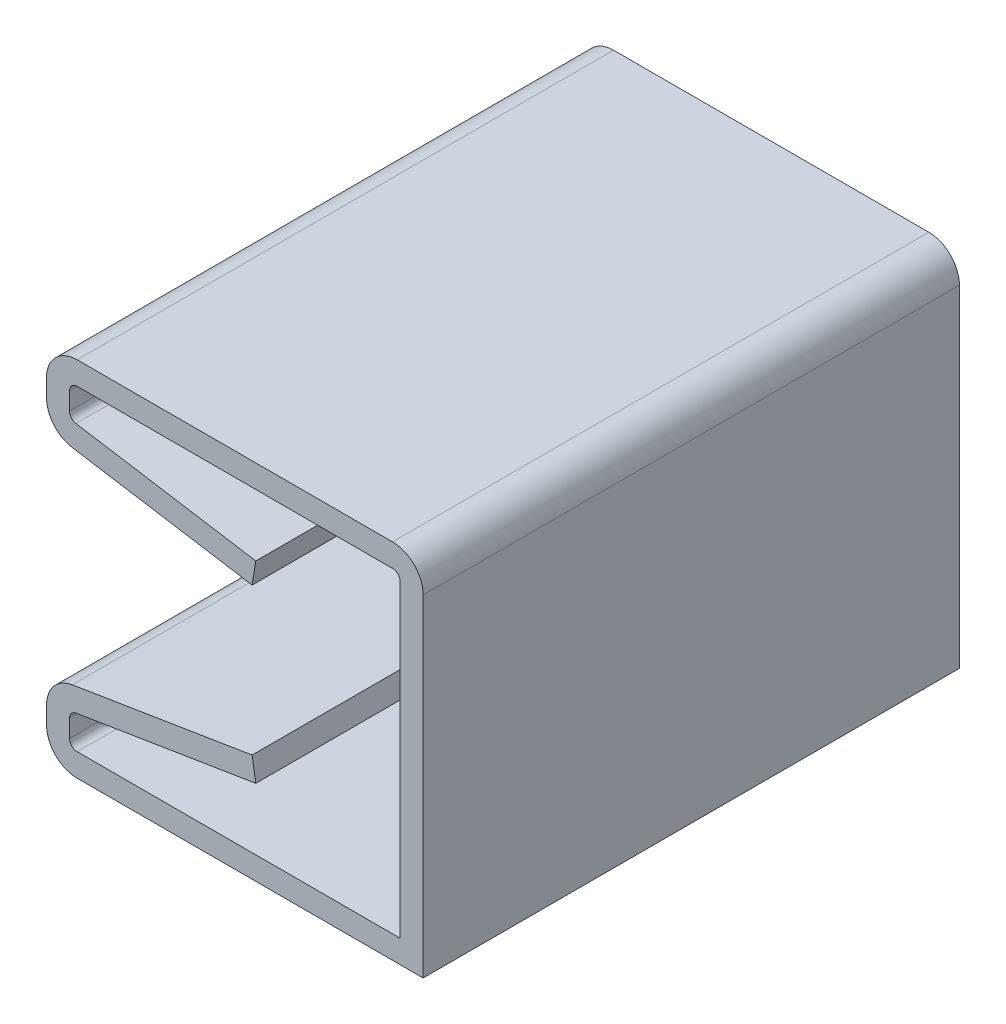
ISO-10303-21;
HEADER;
FILE_DESCRIPTION(('STEP AP214'),'2;1');
FILE_NAME('part.step','',(''),(''),'','','');
FILE_SCHEMA(('AUTOMOTIVE_DESIGN { 1 0 10303 214 1 1 1 1 }'));
ENDSEC;
DATA;
#1=APPLICATION_CONTEXT('core data for automotive mechanical design processes');
#2=APPLICATION_PROTOCOL_DEFINITION('international standard','automotive_design',2000,#1);
#3=PRODUCT_CONTEXT('',#1,'mechanical');
#4=PRODUCT('Part','Part','',(#3));
#5=PRODUCT_RELATED_PRODUCT_CATEGORY('part','',(#4));
#6=PRODUCT_DEFINITION_FORMATION('','',#4);
#7=PRODUCT_DEFINITION_CONTEXT('part definition',#1,'design');
#8=PRODUCT_DEFINITION('design','',#6,#7);
#9=PRODUCT_DEFINITION_SHAPE('','',#8);
#10=(LENGTH_UNIT() NAMED_UNIT(*) SI_UNIT(.MILLI.,.METRE.));
#11=(NAMED_UNIT(*) PLANE_ANGLE_UNIT() SI_UNIT($,.RADIAN.));
#12=(NAMED_UNIT(*) SI_UNIT($,.STERADIAN.) SOLID_ANGLE_UNIT());
#13=UNCERTAINTY_MEASURE_WITH_UNIT(LENGTH_MEASURE(1.E-05),#10,'distance_accuracy_value','');
#14=(GEOMETRIC_REPRESENTATION_CONTEXT(3) GLOBAL_UNCERTAINTY_ASSIGNED_CONTEXT((#13)) GLOBAL_UNIT_ASSIGNED_CONTEXT((#10,
#11,#12)) REPRESENTATION_CONTEXT('',''));
#15=CARTESIAN_POINT('',(0.,0.,0.));
#16=DIRECTION('',(0.,0.,1.));
#17=DIRECTION('',(1.,0.,0.));
#18=AXIS2_PLACEMENT_3D('',#15,#16,#17);
#19=CARTESIAN_POINT('',(4.01502866376,1.9996,0.3862));
#20=DIRECTION('',(-1.,0.,0.));
#21=DIRECTION('',(0.,0.,1.));
#22=AXIS2_PLACEMENT_3D('',#19,#20,#21);
#23=PLANE('',#22);
#24=DIRECTION('',(0.,1.,0.));
#25=VECTOR('',#24,1.);
#26=CARTESIAN_POINT('',(4.01502866376,1.9996,0.3862));
#27=LINE('',#26,#25);
#28=CARTESIAN_POINT('',(4.01502866376,1.9996,0.3862));
#29=VERTEX_POINT('',#28);
#30=CARTESIAN_POINT('',(4.01502866376,1.770085401018,0.3862));
#31=VERTEX_POINT('',#30);
#32=EDGE_CURVE('E329',#29,#31,#27,.F.);
#33=ORIENTED_EDGE('',*,*,#32,.T.);
#34=DIRECTION('',(0.,0.,-1.));
#35=VECTOR('',#34,1.);
#36=CARTESIAN_POINT('',(4.01502866376,1.770085401018,0.3862));
#37=LINE('',#36,#35);
#38=CARTESIAN_POINT('',(4.01502866376,1.770085401018,7.3862));
#39=VERTEX_POINT('',#38);
#40=EDGE_CURVE('E333',#39,#31,#37,.T.);
#41=ORIENTED_EDGE('',*,*,#40,.F.);
#42=DIRECTION('',(0.,1.,0.));
#43=VECTOR('',#42,1.);
#44=CARTESIAN_POINT('',(4.01502866376,1.9996,7.3862));
#45=LINE('',#44,#43);
#46=CARTESIAN_POINT('',(4.01502866376,1.9996,7.3862));
#47=VERTEX_POINT('',#46);
#48=EDGE_CURVE('E338',#39,#47,#45,.T.);
#49=ORIENTED_EDGE('',*,*,#48,.T.);
#50=DIRECTION('',(0.,0.,-1.));
#51=VECTOR('',#50,1.);
#52=CARTESIAN_POINT('',(4.01502866376,1.9996,0.3862));
#53=LINE('',#52,#51);
#54=EDGE_CURVE('E341',#29,#47,#53,.F.);
#55=ORIENTED_EDGE('',*,*,#54,.F.);
#56=EDGE_LOOP('',(#33,#41,#49,#55));
#57=FACE_BOUND('',#56,.T.);
#58=ADVANCED_FACE('F17',(#57),#23,.T.);
#59=CARTESIAN_POINT('',(4.31502866376,1.9996,0.3862));
#60=DIRECTION('',(-1.,0.,0.));
#61=DIRECTION('',(0.,0.,1.));
#62=AXIS2_PLACEMENT_3D('',#59,#60,#61);
#63=PLANE('',#62);
#64=DIRECTION('',(0.,0.,-1.));
#65=VECTOR('',#64,1.);
#66=CARTESIAN_POINT('',(4.31502866376,1.9996,0.3862));
#67=LINE('',#66,#65);
#68=CARTESIAN_POINT('',(4.31502866376,1.9996,0.3862));
#69=VERTEX_POINT('',#68);
#70=CARTESIAN_POINT('',(4.31502866376,1.9996,7.3862));
#71=VERTEX_POINT('',#70);
#72=EDGE_CURVE('E321',#69,#71,#67,.F.);
#73=ORIENTED_EDGE('',*,*,#72,.T.);
#74=DIRECTION('',(0.,1.,0.));
#75=VECTOR('',#74,1.);
#76=CARTESIAN_POINT('',(4.31502866376,1.9996,7.3862));
#77=LINE('',#76,#75);
#78=CARTESIAN_POINT('',(4.31502866376,1.770085401018,7.3862));
#79=VERTEX_POINT('',#78);
#80=EDGE_CURVE('E327',#79,#71,#77,.T.);
#81=ORIENTED_EDGE('',*,*,#80,.F.);
#82=DIRECTION('',(0.,0.,-1.));
#83=VECTOR('',#82,1.);
#84=CARTESIAN_POINT('',(4.31502866376,1.770085401018,0.3862));
#85=LINE('',#84,#83);
#86=CARTESIAN_POINT('',(4.31502866376,1.770085401018,0.3862));
#87=VERTEX_POINT('',#86);
#88=EDGE_CURVE('E330',#79,#87,#85,.T.);
#89=ORIENTED_EDGE('',*,*,#88,.T.);
#90=DIRECTION('',(0.,1.,0.));
#91=VECTOR('',#90,1.);
#92=CARTESIAN_POINT('',(4.31502866376,1.9996,0.3862));
#93=LINE('',#92,#91);
#94=EDGE_CURVE('E316',#69,#87,#93,.F.);
#95=ORIENTED_EDGE('',*,*,#94,.F.);
#96=EDGE_LOOP('',(#73,#81,#89,#95));
#97=FACE_BOUND('',#96,.T.);
#98=ADVANCED_FACE('F461',(#97),#63,.F.);
#99=CARTESIAN_POINT('',(4.31502866376,-1.9304,0.3862));
#100=DIRECTION('',(-1.,0.,0.));
#101=DIRECTION('',(0.,0.,1.));
#102=AXIS2_PLACEMENT_3D('',#99,#100,#101);
#103=PLANE('',#102);
#104=DIRECTION('',(0.,0.,-1.));
#105=VECTOR('',#104,1.);
#106=CARTESIAN_POINT('',(4.31502866376,-1.700885401018,0.3862));
#107=LINE('',#106,#105);
#108=CARTESIAN_POINT('',(4.31502866376,-1.700885401018,0.3862));
#109=VERTEX_POINT('',#108);
#110=CARTESIAN_POINT('',(4.31502866376,-1.700885401018,7.3862));
#111=VERTEX_POINT('',#110);
#112=EDGE_CURVE('E308',#109,#111,#107,.F.);
#113=ORIENTED_EDGE('',*,*,#112,.T.);
#114=DIRECTION('',(0.,1.,0.));
#115=VECTOR('',#114,1.);
#116=CARTESIAN_POINT('',(4.31502866376,-1.9304,7.3862));
#117=LINE('',#116,#115);
#118=CARTESIAN_POINT('',(4.31502866376,-1.9304,7.3862));
#119=VERTEX_POINT('',#118);
#120=EDGE_CURVE('E314',#119,#111,#117,.T.);
#121=ORIENTED_EDGE('',*,*,#120,.F.);
#122=DIRECTION('',(0.,0.,-1.));
#123=VECTOR('',#122,1.);
#124=CARTESIAN_POINT('',(4.31502866376,-1.9304,0.3862));
#125=LINE('',#124,#123);
#126=CARTESIAN_POINT('',(4.31502866376,-1.9304,0.3862));
#127=VERTEX_POINT('',#126);
#128=EDGE_CURVE('E317',#119,#127,#125,.T.);
#129=ORIENTED_EDGE('',*,*,#128,.T.);
#130=DIRECTION('',(0.,1.,0.));
#131=VECTOR('',#130,1.);
#132=CARTESIAN_POINT('',(4.31502866376,-1.9304,0.3862));
#133=LINE('',#132,#131);
#134=EDGE_CURVE('E198',#109,#127,#133,.F.);
#135=ORIENTED_EDGE('',*,*,#134,.F.);
#136=EDGE_LOOP('',(#113,#121,#129,#135));
#137=FACE_BOUND('',#136,.T.);
#138=ADVANCED_FACE('F496',(#137),#103,.F.);
#139=CARTESIAN_POINT('',(4.41502866376,-1.700885401018,0.3862));
#140=DIRECTION('',(0.,0.,-1.));
#141=DIRECTION('',(0.,1.,0.));
#142=AXIS2_PLACEMENT_3D('',#139,#140,#141);
#143=CYLINDRICAL_SURFACE('',#142,0.4);
#144=CARTESIAN_POINT('',(4.41502866376,-1.700885401018,0.3862));
#145=DIRECTION('',(0.,0.,-1.));
#146=DIRECTION('',(0.,1.,0.));
#147=AXIS2_PLACEMENT_3D('',#144,#145,#146);
#148=CIRCLE('',#147,0.4);
#149=CARTESIAN_POINT('',(4.35111498656709,-1.30602461305907,0.3862));
#150=VERTEX_POINT('',#149);
#151=CARTESIAN_POINT('',(4.01502866376,-1.700885401018,0.3862));
#152=VERTEX_POINT('',#151);
#153=EDGE_CURVE('E197',#150,#152,#148,.F.);
#154=ORIENTED_EDGE('',*,*,#153,.T.);
#155=DIRECTION('',(0.,0.,1.));
#156=VECTOR('',#155,1.);
#157=CARTESIAN_POINT('',(4.01502866376,-1.700885401018,0.3862));
#158=LINE('',#157,#156);
#159=CARTESIAN_POINT('',(4.01502866376,-1.700885401018,7.3862));
#160=VERTEX_POINT('',#159);
#161=EDGE_CURVE('E195',#160,#152,#158,.F.);
#162=ORIENTED_EDGE('',*,*,#161,.F.);
#163=CARTESIAN_POINT('',(4.41502866376,-1.700885401018,7.3862));
#164=DIRECTION('',(0.,0.,-1.));
#165=DIRECTION('',(0.,1.,0.));
#166=AXIS2_PLACEMENT_3D('',#163,#164,#165);
#167=CIRCLE('',#166,0.4);
#168=CARTESIAN_POINT('',(4.35111498656709,-1.30602461305907,7.3862));
#169=VERTEX_POINT('',#168);
#170=EDGE_CURVE('E20',#160,#169,#167,.T.);
#171=ORIENTED_EDGE('',*,*,#170,.T.);
#172=DIRECTION('',(0.,0.,1.));
#173=VECTOR('',#172,1.);
#174=CARTESIAN_POINT('',(4.35111498656702,-1.30602461305916,0.3862));
#175=LINE('',#174,#173);
#176=EDGE_CURVE('E192',#150,#169,#175,.T.);
#177=ORIENTED_EDGE('',*,*,#176,.F.);
#178=EDGE_LOOP('',(#154,#162,#171,#177));
#179=FACE_BOUND('',#178,.T.);
#180=ADVANCED_FACE('F191',(#179),#143,.T.);
#181=CARTESIAN_POINT('',(4.41502866376,1.9996,0.3862));
#182=DIRECTION('',(0.,0.,-1.));
#183=DIRECTION('',(0.,1.,0.));
#184=AXIS2_PLACEMENT_3D('',#181,#182,#183);
#185=CYLINDRICAL_SURFACE('',#184,0.4);
#186=CARTESIAN_POINT('',(4.41502866376,1.9996,0.3862));
#187=DIRECTION('',(0.,0.,-1.));
#188=DIRECTION('',(0.,1.,0.));
#189=AXIS2_PLACEMENT_3D('',#186,#187,#188);
#190=CIRCLE('',#189,0.4);
#191=CARTESIAN_POINT('',(4.41502866376,2.3996,0.3862));
#192=VERTEX_POINT('',#191);
#193=EDGE_CURVE('E344',#192,#29,#190,.F.);
#194=ORIENTED_EDGE('',*,*,#193,.T.);
#195=ORIENTED_EDGE('',*,*,#54,.T.);
#196=CARTESIAN_POINT('',(4.41502866376,1.9996,7.3862));
#197=DIRECTION('',(0.,0.,-1.));
#198=DIRECTION('',(0.,1.,0.));
#199=AXIS2_PLACEMENT_3D('',#196,#197,#198);
#200=CIRCLE('',#199,0.4);
#201=CARTESIAN_POINT('',(4.41502866376,2.3996,7.3862));
#202=VERTEX_POINT('',#201);
#203=EDGE_CURVE('E377',#47,#202,#200,.T.);
#204=ORIENTED_EDGE('',*,*,#203,.T.);
#205=DIRECTION('',(0.,0.,1.));
#206=VECTOR('',#205,1.);
#207=CARTESIAN_POINT('',(4.41502866376,2.3996,0.3862));
#208=LINE('',#207,#206);
#209=EDGE_CURVE('E206',#192,#202,#208,.T.);
#210=ORIENTED_EDGE('',*,*,#209,.F.);
#211=EDGE_LOOP('',(#194,#195,#204,#210));
#212=FACE_BOUND('',#211,.T.);
#213=ADVANCED_FACE('F430',(#212),#185,.T.);
#214=CARTESIAN_POINT('',(4.41502866376,1.770085401018,0.3862));
#215=DIRECTION('',(0.,0.,-1.));
#216=DIRECTION('',(0.,1.,0.));
#217=AXIS2_PLACEMENT_3D('',#214,#215,#216);
#218=CYLINDRICAL_SURFACE('',#217,0.4);
#219=CARTESIAN_POINT('',(4.41502866376,1.770085401018,0.3862));
#220=DIRECTION('',(0.,0.,-1.));
#221=DIRECTION('',(0.,1.,0.));
#222=AXIS2_PLACEMENT_3D('',#219,#220,#221);
#223=CIRCLE('',#222,0.4);
#224=CARTESIAN_POINT('',(4.35111498656709,1.37522461305907,0.3862));
#225=VERTEX_POINT('',#224);
#226=EDGE_CURVE('E305',#31,#225,#223,.F.);
#227=ORIENTED_EDGE('',*,*,#226,.T.);
#228=DIRECTION('',(0.,0.,1.));
#229=VECTOR('',#228,1.);
#230=CARTESIAN_POINT('',(4.35111498656703,1.37522461305916,0.3862));
#231=LINE('',#230,#229);
#232=CARTESIAN_POINT('',(4.35111498656709,1.37522461305907,7.3862));
#233=VERTEX_POINT('',#232);
#234=EDGE_CURVE('E270',#233,#225,#231,.F.);
#235=ORIENTED_EDGE('',*,*,#234,.F.);
#236=CARTESIAN_POINT('',(4.41502866376,1.770085401018,7.3862));
#237=DIRECTION('',(0.,0.,-1.));
#238=DIRECTION('',(0.,1.,0.));
#239=AXIS2_PLACEMENT_3D('',#236,#237,#238);
#240=CIRCLE('',#239,0.4);
#241=EDGE_CURVE('E336',#233,#39,#240,.T.);
#242=ORIENTED_EDGE('',*,*,#241,.T.);
#243=ORIENTED_EDGE('',*,*,#40,.T.);
#244=EDGE_LOOP('',(#227,#235,#242,#243));
#245=FACE_BOUND('',#244,.T.);
#246=ADVANCED_FACE('F438',(#245),#218,.T.);
#247=CARTESIAN_POINT('',(6.698136367052,0.995326756773,0.3862));
#248=DIRECTION('',(-0.987151969897797,0.159784192981967,0.));
#249=DIRECTION('',(-0.159784192981967,-0.987151969897797,0.));
#250=AXIS2_PLACEMENT_3D('',#247,#248,#249);
#251=PLANE('',#250);
#252=DIRECTION('',(0.,0.,1.));
#253=VECTOR('',#252,1.);
#254=CARTESIAN_POINT('',(6.74607162494707,1.29147234774245,0.3862));
#255=LINE('',#254,#253);
#256=CARTESIAN_POINT('',(6.74607162494687,1.29147234774217,0.3862));
#257=VERTEX_POINT('',#256);
#258=CARTESIAN_POINT('',(6.74607162494687,1.29147234774218,7.3862));
#259=VERTEX_POINT('',#258);
#260=EDGE_CURVE('E264',#257,#259,#255,.T.);
#261=ORIENTED_EDGE('',*,*,#260,.T.);
#262=DIRECTION('',(-0.159784192981967,-0.987151969897797,0.));
#263=VECTOR('',#262,1.);
#264=CARTESIAN_POINT('',(6.698136367052,0.995326756773,7.3862));
#265=LINE('',#264,#263);
#266=CARTESIAN_POINT('',(6.69813636705203,0.995326756773203,7.3862));
#267=VERTEX_POINT('',#266);
#268=EDGE_CURVE('E301',#267,#259,#265,.F.);
#269=ORIENTED_EDGE('',*,*,#268,.F.);
#270=DIRECTION('',(0.,0.,1.));
#271=VECTOR('',#270,1.);
#272=CARTESIAN_POINT('',(6.6981363670521,0.995326756773609,0.3862));
#273=LINE('',#272,#271);
#274=CARTESIAN_POINT('',(6.69813636705203,0.995326756773203,0.3862));
#275=VERTEX_POINT('',#274);
#276=EDGE_CURVE('E267',#275,#267,#273,.T.);
#277=ORIENTED_EDGE('',*,*,#276,.F.);
#278=DIRECTION('',(-0.159784192981967,-0.987151969897797,0.));
#279=VECTOR('',#278,1.);
#280=CARTESIAN_POINT('',(6.698136367052,0.995326756773,0.3862));
#281=LINE('',#280,#279);
#282=EDGE_CURVE('E298',#257,#275,#281,.T.);
#283=ORIENTED_EDGE('',*,*,#282,.F.);
#284=EDGE_LOOP('',(#261,#269,#277,#283));
#285=FACE_BOUND('',#284,.T.);
#286=ADVANCED_FACE('F446',(#285),#251,.F.);
#287=CARTESIAN_POINT('',(4.41502866376,1.770085401018,0.3862));
#288=DIRECTION('',(0.,0.,-1.));
#289=DIRECTION('',(0.,1.,0.));
#290=AXIS2_PLACEMENT_3D('',#287,#288,#289);
#291=CYLINDRICAL_SURFACE('',#290,0.1);
#292=ORIENTED_EDGE('',*,*,#88,.F.);
#293=CARTESIAN_POINT('',(4.41502866376,1.770085401018,7.3862));
#294=DIRECTION('',(0.,0.,-1.));
#295=DIRECTION('',(0.,1.,0.));
#296=AXIS2_PLACEMENT_3D('',#293,#294,#295);
#297=CIRCLE('',#296,0.1);
#298=CARTESIAN_POINT('',(4.39905024446188,1.67137020402802,7.3862));
#299=VERTEX_POINT('',#298);
#300=EDGE_CURVE('E300',#299,#79,#297,.T.);
#301=ORIENTED_EDGE('',*,*,#300,.F.);
#302=DIRECTION('',(0.,0.,1.));
#303=VECTOR('',#302,1.);
#304=CARTESIAN_POINT('',(4.399050244462,1.671370204028,0.3862));
#305=LINE('',#304,#303);
#306=CARTESIAN_POINT('',(4.39905024446188,1.67137020402802,0.3862));
#307=VERTEX_POINT('',#306);
#308=EDGE_CURVE('E259',#299,#307,#305,.F.);
#309=ORIENTED_EDGE('',*,*,#308,.T.);
#310=CARTESIAN_POINT('',(4.41502866376,1.770085401018,0.3862));
#311=DIRECTION('',(0.,0.,-1.));
#312=DIRECTION('',(0.,1.,0.));
#313=AXIS2_PLACEMENT_3D('',#310,#311,#312);
#314=CIRCLE('',#313,0.1);
#315=EDGE_CURVE('E325',#87,#307,#314,.F.);
#316=ORIENTED_EDGE('',*,*,#315,.F.);
#317=EDGE_LOOP('',(#292,#301,#309,#316));
#318=FACE_BOUND('',#317,.T.);
#319=ADVANCED_FACE('F459',(#318),#291,.F.);
#320=CARTESIAN_POINT('',(4.41502866376,1.9996,0.3862));
#321=DIRECTION('',(0.,0.,-1.));
#322=DIRECTION('',(0.,1.,0.));
#323=AXIS2_PLACEMENT_3D('',#320,#321,#322);
#324=CYLINDRICAL_SURFACE('',#323,0.1);
#325=DIRECTION('',(0.,0.,1.));
#326=VECTOR('',#325,1.);
#327=CARTESIAN_POINT('',(4.41502866376,2.0996,0.3862));
#328=LINE('',#327,#326);
#329=CARTESIAN_POINT('',(4.41502866376,2.0996,0.3862));
#330=VERTEX_POINT('',#329);
#331=CARTESIAN_POINT('',(4.41502866376,2.0996,7.3862));
#332=VERTEX_POINT('',#331);
#333=EDGE_CURVE('E256',#330,#332,#328,.T.);
#334=ORIENTED_EDGE('',*,*,#333,.T.);
#335=CARTESIAN_POINT('',(4.41502866376,1.9996,7.3862));
#336=DIRECTION('',(0.,0.,-1.));
#337=DIRECTION('',(0.,1.,0.));
#338=AXIS2_PLACEMENT_3D('',#335,#336,#337);
#339=CIRCLE('',#338,0.1);
#340=EDGE_CURVE('E324',#71,#332,#339,.T.);
#341=ORIENTED_EDGE('',*,*,#340,.F.);
#342=ORIENTED_EDGE('',*,*,#72,.F.);
#343=CARTESIAN_POINT('',(4.41502866376,1.9996,0.3862));
#344=DIRECTION('',(0.,0.,-1.));
#345=DIRECTION('',(0.,1.,0.));
#346=AXIS2_PLACEMENT_3D('',#343,#344,#345);
#347=CIRCLE('',#346,0.1);
#348=EDGE_CURVE('E366',#330,#69,#347,.F.);
#349=ORIENTED_EDGE('',*,*,#348,.F.);
#350=EDGE_LOOP('',(#334,#341,#342,#349));
#351=FACE_BOUND('',#350,.T.);
#352=ADVANCED_FACE('F467',(#351),#324,.F.);
#353=CARTESIAN_POINT('',(8.5304,1.9996,0.3862));
#354=DIRECTION('',(0.,0.,-1.));
#355=DIRECTION('',(0.,1.,0.));
#356=AXIS2_PLACEMENT_3D('',#353,#354,#355);
#357=CYLINDRICAL_SURFACE('',#356,0.1);
#358=DIRECTION('',(0.,0.,-1.));
#359=VECTOR('',#358,1.);
#360=CARTESIAN_POINT('',(8.6304,1.9996,0.3862));
#361=LINE('',#360,#359);
#362=CARTESIAN_POINT('',(8.6304,1.9996,0.3862));
#363=VERTEX_POINT('',#362);
#364=CARTESIAN_POINT('',(8.6304,1.9996,7.3862));
#365=VERTEX_POINT('',#364);
#366=EDGE_CURVE('E250',#363,#365,#361,.F.);
#367=ORIENTED_EDGE('',*,*,#366,.T.);
#368=CARTESIAN_POINT('',(8.5304,1.9996,7.3862));
#369=DIRECTION('',(0.,0.,-1.));
#370=DIRECTION('',(0.,1.,0.));
#371=AXIS2_PLACEMENT_3D('',#368,#369,#370);
#372=CIRCLE('',#371,0.1);
#373=CARTESIAN_POINT('',(8.5304,2.0996,7.3862));
#374=VERTEX_POINT('',#373);
#375=EDGE_CURVE('E364',#374,#365,#372,.T.);
#376=ORIENTED_EDGE('',*,*,#375,.F.);
#377=DIRECTION('',(0.,0.,1.));
#378=VECTOR('',#377,1.);
#379=CARTESIAN_POINT('',(8.5304,2.0996,0.3862));
#380=LINE('',#379,#378);
#381=CARTESIAN_POINT('',(8.5304,2.0996,0.3862));
#382=VERTEX_POINT('',#381);
#383=EDGE_CURVE('E255',#374,#382,#380,.F.);
#384=ORIENTED_EDGE('',*,*,#383,.T.);
#385=CARTESIAN_POINT('',(8.5304,1.9996,0.3862));
#386=DIRECTION('',(0.,0.,-1.));
#387=DIRECTION('',(0.,1.,0.));
#388=AXIS2_PLACEMENT_3D('',#385,#386,#387);
#389=CIRCLE('',#388,0.1);
#390=EDGE_CURVE('E362',#363,#382,#389,.F.);
#391=ORIENTED_EDGE('',*,*,#390,.F.);
#392=EDGE_LOOP('',(#367,#376,#384,#391));
#393=FACE_BOUND('',#392,.T.);
#394=ADVANCED_FACE('F475',(#393),#357,.F.);
#395=CARTESIAN_POINT('',(4.41502866376,-1.9304,0.3862));
#396=DIRECTION('',(0.,0.,-1.));
#397=DIRECTION('',(0.,1.,0.));
#398=AXIS2_PLACEMENT_3D('',#395,#396,#397);
#399=CYLINDRICAL_SURFACE('',#398,0.1);
#400=ORIENTED_EDGE('',*,*,#128,.F.);
#401=CARTESIAN_POINT('',(4.41502866376,-1.9304,7.3862));
#402=DIRECTION('',(0.,0.,-1.));
#403=DIRECTION('',(0.,1.,0.));
#404=AXIS2_PLACEMENT_3D('',#401,#402,#403);
#405=CIRCLE('',#404,0.1);
#406=CARTESIAN_POINT('',(4.41502866376,-2.0304,7.3862));
#407=VERTEX_POINT('',#406);
#408=EDGE_CURVE('E320',#407,#119,#405,.T.);
#409=ORIENTED_EDGE('',*,*,#408,.F.);
#410=DIRECTION('',(0.,0.,-1.));
#411=VECTOR('',#410,1.);
#412=CARTESIAN_POINT('',(4.41502866376,-2.0304,0.3862));
#413=LINE('',#412,#411);
#414=CARTESIAN_POINT('',(4.41502866376,-2.0304,0.3862));
#415=VERTEX_POINT('',#414);
#416=EDGE_CURVE('E241',#407,#415,#413,.T.);
#417=ORIENTED_EDGE('',*,*,#416,.T.);
#418=CARTESIAN_POINT('',(4.41502866376,-1.9304,0.3862));
#419=DIRECTION('',(0.,0.,-1.));
#420=DIRECTION('',(0.,1.,0.));
#421=AXIS2_PLACEMENT_3D('',#418,#419,#420);
#422=CIRCLE('',#421,0.1);
#423=EDGE_CURVE('E312',#127,#415,#422,.F.);
#424=ORIENTED_EDGE('',*,*,#423,.F.);
#425=EDGE_LOOP('',(#400,#409,#417,#424));
#426=FACE_BOUND('',#425,.T.);
#427=ADVANCED_FACE('F493',(#426),#399,.F.);
#428=CARTESIAN_POINT('',(4.41502866376,-1.700885401018,0.3862));
#429=DIRECTION('',(0.,0.,-1.));
#430=DIRECTION('',(0.,1.,0.));
#431=AXIS2_PLACEMENT_3D('',#428,#429,#430);
#432=CYLINDRICAL_SURFACE('',#431,0.1);
#433=DIRECTION('',(0.,0.,1.));
#434=VECTOR('',#433,1.);
#435=CARTESIAN_POINT('',(4.399050244462,-1.602170204028,0.3862));
#436=LINE('',#435,#434);
#437=CARTESIAN_POINT('',(4.39905024446188,-1.60217020402802,0.3862));
#438=VERTEX_POINT('',#437);
#439=CARTESIAN_POINT('',(4.39905024446188,-1.60217020402802,7.3862));
#440=VERTEX_POINT('',#439);
#441=EDGE_CURVE('E237',#438,#440,#436,.T.);
#442=ORIENTED_EDGE('',*,*,#441,.T.);
#443=CARTESIAN_POINT('',(4.41502866376,-1.700885401018,7.3862));
#444=DIRECTION('',(0.,0.,-1.));
#445=DIRECTION('',(0.,1.,0.));
#446=AXIS2_PLACEMENT_3D('',#443,#444,#445);
#447=CIRCLE('',#446,0.1);
#448=EDGE_CURVE('E311',#111,#440,#447,.T.);
#449=ORIENTED_EDGE('',*,*,#448,.F.);
#450=ORIENTED_EDGE('',*,*,#112,.F.);
#451=CARTESIAN_POINT('',(4.41502866376,-1.700885401018,0.3862));
#452=DIRECTION('',(0.,0.,-1.));
#453=DIRECTION('',(0.,1.,0.));
#454=AXIS2_PLACEMENT_3D('',#451,#452,#453);
#455=CIRCLE('',#454,0.1);
#456=EDGE_CURVE('E292',#438,#109,#455,.F.);
#457=ORIENTED_EDGE('',*,*,#456,.F.);
#458=EDGE_LOOP('',(#442,#449,#450,#457));
#459=FACE_BOUND('',#458,.T.);
#460=ADVANCED_FACE('F500',(#459),#432,.F.);
#461=CARTESIAN_POINT('',(6.746071624947,-1.222272347742,0.3862));
#462=DIRECTION('',(-0.987151969897797,-0.159784192981967,0.));
#463=DIRECTION('',(0.159784192981967,-0.987151969897797,0.));
#464=AXIS2_PLACEMENT_3D('',#461,#462,#463);
#465=PLANE('',#464);
#466=DIRECTION('',(0.,0.,1.));
#467=VECTOR('',#466,1.);
#468=CARTESIAN_POINT('',(6.6981363670521,-0.926126756773609,0.3862));
#469=LINE('',#468,#467);
#470=CARTESIAN_POINT('',(6.69813636705218,-0.926126756773178,7.3862));
#471=VERTEX_POINT('',#470);
#472=CARTESIAN_POINT('',(6.69813636705218,-0.926126756773179,0.3862));
#473=VERTEX_POINT('',#472);
#474=EDGE_CURVE('E207',#471,#473,#469,.F.);
#475=ORIENTED_EDGE('',*,*,#474,.F.);
#476=DIRECTION('',(0.159784192981967,-0.987151969897797,0.));
#477=VECTOR('',#476,1.);
#478=CARTESIAN_POINT('',(6.746071624947,-1.222272347742,7.3862));
#479=LINE('',#478,#477);
#480=CARTESIAN_POINT('',(6.74607162494702,-1.22227234774215,7.3862));
#481=VERTEX_POINT('',#480);
#482=EDGE_CURVE('E212',#481,#471,#479,.F.);
#483=ORIENTED_EDGE('',*,*,#482,.F.);
#484=DIRECTION('',(0.,0.,1.));
#485=VECTOR('',#484,1.);
#486=CARTESIAN_POINT('',(6.74607162494707,-1.22227234774245,0.3862));
#487=LINE('',#486,#485);
#488=CARTESIAN_POINT('',(6.74607162494702,-1.22227234774215,0.3862));
#489=VERTEX_POINT('',#488);
#490=EDGE_CURVE('E240',#481,#489,#487,.F.);
#491=ORIENTED_EDGE('',*,*,#490,.T.);
#492=DIRECTION('',(0.159784192981967,-0.987151969897797,0.));
#493=VECTOR('',#492,1.);
#494=CARTESIAN_POINT('',(6.746071624947,-1.222272347742,0.3862));
#495=LINE('',#494,#493);
#496=EDGE_CURVE('E290',#473,#489,#495,.T.);
#497=ORIENTED_EDGE('',*,*,#496,.F.);
#498=EDGE_LOOP('',(#475,#483,#491,#497));
#499=FACE_BOUND('',#498,.T.);
#500=ADVANCED_FACE('F509',(#499),#465,.F.);
#501=CARTESIAN_POINT('',(4.01502866376,-1.9304,0.3862));
#502=DIRECTION('',(-1.,0.,0.));
#503=DIRECTION('',(0.,0.,1.));
#504=AXIS2_PLACEMENT_3D('',#501,#502,#503);
#505=PLANE('',#504);
#506=DIRECTION('',(0.,1.,0.));
#507=VECTOR('',#506,1.);
#508=CARTESIAN_POINT('',(4.01502866376,-1.9304,0.3862));
#509=LINE('',#508,#507);
#510=CARTESIAN_POINT('',(4.01502866376,-1.9304,0.3862));
#511=VERTEX_POINT('',#510);
#512=EDGE_CURVE('E285',#152,#511,#509,.F.);
#513=ORIENTED_EDGE('',*,*,#512,.T.);
#514=DIRECTION('',(0.,0.,-1.));
#515=VECTOR('',#514,1.);
#516=CARTESIAN_POINT('',(4.01502866376,-1.9304,0.3862));
#517=LINE('',#516,#515);
#518=CARTESIAN_POINT('',(4.01502866376,-1.9304,7.3862));
#519=VERTEX_POINT('',#518);
#520=EDGE_CURVE('E280',#519,#511,#517,.T.);
#521=ORIENTED_EDGE('',*,*,#520,.F.);
#522=DIRECTION('',(0.,-1.,0.));
#523=VECTOR('',#522,1.);
#524=CARTESIAN_POINT('',(4.01502866376,-1.700885401018,7.3862));
#525=LINE('',#524,#523);
#526=EDGE_CURVE('E214',#160,#519,#525,.T.);
#527=ORIENTED_EDGE('',*,*,#526,.F.);
#528=ORIENTED_EDGE('',*,*,#161,.T.);
#529=EDGE_LOOP('',(#513,#521,#527,#528));
#530=FACE_BOUND('',#529,.T.);
#531=ADVANCED_FACE('F383',(#530),#505,.T.);
#532=CARTESIAN_POINT('',(4.351114986568,-1.306024613059,0.3862));
#533=DIRECTION('',(-0.159784192981967,0.987151969897797,0.));
#534=DIRECTION('',(-0.987151969897797,-0.159784192981967,0.));
#535=AXIS2_PLACEMENT_3D('',#532,#533,#534);
#536=PLANE('',#535);
#537=DIRECTION('',(-0.987151969897767,-0.159784192982157,0.));
#538=VECTOR('',#537,1.);
#539=CARTESIAN_POINT('',(6.698136367052,-0.926126756773,0.3862));
#540=LINE('',#539,#538);
#541=EDGE_CURVE('E205',#473,#150,#540,.T.);
#542=ORIENTED_EDGE('',*,*,#541,.T.);
#543=ORIENTED_EDGE('',*,*,#176,.T.);
#544=DIRECTION('',(-0.987151969897767,-0.159784192982157,0.));
#545=VECTOR('',#544,1.);
#546=CARTESIAN_POINT('',(6.698136367052,-0.926126756773,7.3862));
#547=LINE('',#546,#545);
#548=EDGE_CURVE('E203',#471,#169,#547,.T.);
#549=ORIENTED_EDGE('',*,*,#548,.F.);
#550=ORIENTED_EDGE('',*,*,#474,.T.);
#551=EDGE_LOOP('',(#542,#543,#549,#550));
#552=FACE_BOUND('',#551,.T.);
#553=ADVANCED_FACE('F201',(#552),#536,.T.);
#554=CARTESIAN_POINT('',(4.41502866376,2.3996,0.3862));
#555=DIRECTION('',(0.,1.,0.));
#556=DIRECTION('',(0.,0.,1.));
#557=AXIS2_PLACEMENT_3D('',#554,#555,#556);
#558=PLANE('',#557);
#559=DIRECTION('',(1.,0.,0.));
#560=VECTOR('',#559,1.);
#561=CARTESIAN_POINT('',(4.41502866376,2.3996,0.3862));
#562=LINE('',#561,#560);
#563=CARTESIAN_POINT('',(8.5304,2.3996,0.3862));
#564=VERTEX_POINT('',#563);
#565=EDGE_CURVE('E348',#564,#192,#562,.F.);
#566=ORIENTED_EDGE('',*,*,#565,.T.);
#567=ORIENTED_EDGE('',*,*,#209,.T.);
#568=DIRECTION('',(1.,0.,0.));
#569=VECTOR('',#568,1.);
#570=CARTESIAN_POINT('',(4.41502866376,2.3996,7.3862));
#571=LINE('',#570,#569);
#572=CARTESIAN_POINT('',(8.5304,2.3996,7.3862));
#573=VERTEX_POINT('',#572);
#574=EDGE_CURVE('E356',#573,#202,#571,.F.);
#575=ORIENTED_EDGE('',*,*,#574,.F.);
#576=DIRECTION('',(0.,0.,-1.));
#577=VECTOR('',#576,1.);
#578=CARTESIAN_POINT('',(8.5304,2.3996,0.3862));
#579=LINE('',#578,#577);
#580=EDGE_CURVE('E219',#564,#573,#579,.F.);
#581=ORIENTED_EDGE('',*,*,#580,.F.);
#582=EDGE_LOOP('',(#566,#567,#575,#581));
#583=FACE_BOUND('',#582,.T.);
#584=ADVANCED_FACE('F426',(#583),#558,.T.);
#585=CARTESIAN_POINT('',(4.351114986568,1.375224613059,0.3862));
#586=DIRECTION('',(-0.159784192981967,-0.987151969897797,0.));
#587=DIRECTION('',(0.987151969897797,-0.159784192981967,0.));
#588=AXIS2_PLACEMENT_3D('',#585,#586,#587);
#589=PLANE('',#588);
#590=DIRECTION('',(0.987151969897767,-0.159784192982157,0.));
#591=VECTOR('',#590,1.);
#592=CARTESIAN_POINT('',(4.351114986567,1.375224613059,0.3862));
#593=LINE('',#592,#591);
#594=EDGE_CURVE('E444',#225,#275,#593,.T.);
#595=ORIENTED_EDGE('',*,*,#594,.T.);
#596=ORIENTED_EDGE('',*,*,#276,.T.);
#597=DIRECTION('',(0.987151969897767,-0.159784192982157,0.));
#598=VECTOR('',#597,1.);
#599=CARTESIAN_POINT('',(4.351114986567,1.375224613059,7.3862));
#600=LINE('',#599,#598);
#601=EDGE_CURVE('E416',#233,#267,#600,.T.);
#602=ORIENTED_EDGE('',*,*,#601,.F.);
#603=ORIENTED_EDGE('',*,*,#234,.T.);
#604=EDGE_LOOP('',(#595,#596,#602,#603));
#605=FACE_BOUND('',#604,.T.);
#606=ADVANCED_FACE('F442',(#605),#589,.T.);
#607=CARTESIAN_POINT('',(4.399050244462,1.671370204028,0.3862));
#608=DIRECTION('',(-0.159784192981967,-0.987151969897797,0.));
#609=DIRECTION('',(0.987151969897797,-0.159784192981967,0.));
#610=AXIS2_PLACEMENT_3D('',#607,#608,#609);
#611=PLANE('',#610);
#612=ORIENTED_EDGE('',*,*,#308,.F.);
#613=DIRECTION('',(-0.987151969897766,0.159784192982157,0.));
#614=VECTOR('',#613,1.);
#615=CARTESIAN_POINT('',(6.746071624947,1.291472347742,7.3862));
#616=LINE('',#615,#614);
#617=EDGE_CURVE('E413',#259,#299,#616,.T.);
#618=ORIENTED_EDGE('',*,*,#617,.F.);
#619=ORIENTED_EDGE('',*,*,#260,.F.);
#620=DIRECTION('',(-0.987151969897766,0.159784192982157,0.));
#621=VECTOR('',#620,1.);
#622=CARTESIAN_POINT('',(6.746071624947,1.291472347742,0.3862));
#623=LINE('',#622,#621);
#624=EDGE_CURVE('E455',#257,#307,#623,.T.);
#625=ORIENTED_EDGE('',*,*,#624,.T.);
#626=EDGE_LOOP('',(#612,#618,#619,#625));
#627=FACE_BOUND('',#626,.T.);
#628=ADVANCED_FACE('F452',(#627),#611,.F.);
#629=CARTESIAN_POINT('',(4.41502866376,2.0996,0.3862));
#630=DIRECTION('',(0.,1.,0.));
#631=DIRECTION('',(0.,0.,1.));
#632=AXIS2_PLACEMENT_3D('',#629,#630,#631);
#633=PLANE('',#632);
#634=ORIENTED_EDGE('',*,*,#383,.F.);
#635=DIRECTION('',(1.,0.,0.));
#636=VECTOR('',#635,1.);
#637=CARTESIAN_POINT('',(4.41502866376,2.0996,7.3862));
#638=LINE('',#637,#636);
#639=EDGE_CURVE('E408',#332,#374,#638,.T.);
#640=ORIENTED_EDGE('',*,*,#639,.F.);
#641=ORIENTED_EDGE('',*,*,#333,.F.);
#642=DIRECTION('',(1.,0.,0.));
#643=VECTOR('',#642,1.);
#644=CARTESIAN_POINT('',(4.41502866376,2.0996,0.3862));
#645=LINE('',#644,#643);
#646=EDGE_CURVE('E473',#330,#382,#645,.T.);
#647=ORIENTED_EDGE('',*,*,#646,.T.);
#648=EDGE_LOOP('',(#634,#640,#641,#647));
#649=FACE_BOUND('',#648,.T.);
#650=ADVANCED_FACE('F472',(#649),#633,.F.);
#651=CARTESIAN_POINT('',(8.6304,1.9996,0.3862));
#652=DIRECTION('',(1.,0.,0.));
#653=DIRECTION('',(0.,0.,-1.));
#654=AXIS2_PLACEMENT_3D('',#651,#652,#653);
#655=PLANE('',#654);
#656=DIRECTION('',(0.,0.,-1.));
#657=VECTOR('',#656,1.);
#658=CARTESIAN_POINT('',(8.6304,-2.0304,0.3862));
#659=LINE('',#658,#657);
#660=CARTESIAN_POINT('',(8.6304,-2.0304,0.3862));
#661=VERTEX_POINT('',#660);
#662=CARTESIAN_POINT('',(8.6304,-2.0304,7.3862));
#663=VERTEX_POINT('',#662);
#664=EDGE_CURVE('E248',#661,#663,#659,.F.);
#665=ORIENTED_EDGE('',*,*,#664,.T.);
#666=DIRECTION('',(0.,-1.,0.));
#667=VECTOR('',#666,1.);
#668=CARTESIAN_POINT('',(8.6304,-1.700885401018,7.3862));
#669=LINE('',#668,#667);
#670=EDGE_CURVE('E403',#365,#663,#669,.T.);
#671=ORIENTED_EDGE('',*,*,#670,.F.);
#672=ORIENTED_EDGE('',*,*,#366,.F.);
#673=DIRECTION('',(0.,-1.,0.));
#674=VECTOR('',#673,1.);
#675=CARTESIAN_POINT('',(8.6304,-1.700885401018,0.3862));
#676=LINE('',#675,#674);
#677=EDGE_CURVE('E483',#363,#661,#676,.T.);
#678=ORIENTED_EDGE('',*,*,#677,.T.);
#679=EDGE_LOOP('',(#665,#671,#672,#678));
#680=FACE_BOUND('',#679,.T.);
#681=ADVANCED_FACE('F480',(#680),#655,.F.);
#682=CARTESIAN_POINT('',(8.9304,-2.0304,0.3862));
#683=DIRECTION('',(0.,-1.,0.));
#684=DIRECTION('',(0.,0.,-1.));
#685=AXIS2_PLACEMENT_3D('',#682,#683,#684);
#686=PLANE('',#685);
#687=ORIENTED_EDGE('',*,*,#416,.F.);
#688=DIRECTION('',(1.,0.,0.));
#689=VECTOR('',#688,1.);
#690=CARTESIAN_POINT('',(4.41502866376,-2.0304,7.3862));
#691=LINE('',#690,#689);
#692=EDGE_CURVE('E353',#663,#407,#691,.F.);
#693=ORIENTED_EDGE('',*,*,#692,.F.);
#694=ORIENTED_EDGE('',*,*,#664,.F.);
#695=DIRECTION('',(1.,0.,0.));
#696=VECTOR('',#695,1.);
#697=CARTESIAN_POINT('',(4.41502866376,-2.0304,0.3862));
#698=LINE('',#697,#696);
#699=EDGE_CURVE('E489',#661,#415,#698,.F.);
#700=ORIENTED_EDGE('',*,*,#699,.T.);
#701=EDGE_LOOP('',(#687,#693,#694,#700));
#702=FACE_BOUND('',#701,.T.);
#703=ADVANCED_FACE('F488',(#702),#686,.F.);
#704=CARTESIAN_POINT('',(4.399050244462,-1.602170204028,0.3862));
#705=DIRECTION('',(-0.159784192981967,0.987151969897797,0.));
#706=DIRECTION('',(-0.987151969897797,-0.159784192981967,0.));
#707=AXIS2_PLACEMENT_3D('',#704,#705,#706);
#708=PLANE('',#707);
#709=ORIENTED_EDGE('',*,*,#490,.F.);
#710=DIRECTION('',(0.987151969897766,0.159784192982157,0.));
#711=VECTOR('',#710,1.);
#712=CARTESIAN_POINT('',(4.399050244462,-1.602170204028,7.3862));
#713=LINE('',#712,#711);
#714=EDGE_CURVE('E215',#440,#481,#713,.T.);
#715=ORIENTED_EDGE('',*,*,#714,.F.);
#716=ORIENTED_EDGE('',*,*,#441,.F.);
#717=DIRECTION('',(0.987151969897766,0.159784192982157,0.));
#718=VECTOR('',#717,1.);
#719=CARTESIAN_POINT('',(4.399050244462,-1.602170204028,0.3862));
#720=LINE('',#719,#718);
#721=EDGE_CURVE('E230',#438,#489,#720,.T.);
#722=ORIENTED_EDGE('',*,*,#721,.T.);
#723=EDGE_LOOP('',(#709,#715,#716,#722));
#724=FACE_BOUND('',#723,.T.);
#725=ADVANCED_FACE('F505',(#724),#708,.F.);
#726=CARTESIAN_POINT('',(8.5304,1.9996,0.3862));
#727=DIRECTION('',(0.,0.,-1.));
#728=DIRECTION('',(0.,1.,0.));
#729=AXIS2_PLACEMENT_3D('',#726,#727,#728);
#730=CYLINDRICAL_SURFACE('',#729,0.4);
#731=CARTESIAN_POINT('',(8.5304,1.9996,0.3862));
#732=DIRECTION('',(0.,0.,-1.));
#733=DIRECTION('',(0.,1.,0.));
#734=AXIS2_PLACEMENT_3D('',#731,#732,#733);
#735=CIRCLE('',#734,0.4);
#736=CARTESIAN_POINT('',(8.9304,1.9996,0.3862));
#737=VERTEX_POINT('',#736);
#738=EDGE_CURVE('E345',#737,#564,#735,.F.);
#739=ORIENTED_EDGE('',*,*,#738,.T.);
#740=ORIENTED_EDGE('',*,*,#580,.T.);
#741=CARTESIAN_POINT('',(8.5304,1.9996,7.3862));
#742=DIRECTION('',(0.,0.,-1.));
#743=DIRECTION('',(0.,1.,0.));
#744=AXIS2_PLACEMENT_3D('',#741,#742,#743);
#745=CIRCLE('',#744,0.4);
#746=CARTESIAN_POINT('',(8.9304,1.9996,7.3862));
#747=VERTEX_POINT('',#746);
#748=EDGE_CURVE('E217',#747,#573,#745,.F.);
#749=ORIENTED_EDGE('',*,*,#748,.F.);
#750=DIRECTION('',(0.,0.,-1.));
#751=VECTOR('',#750,1.);
#752=CARTESIAN_POINT('',(8.9304,1.9996,0.3862));
#753=LINE('',#752,#751);
#754=EDGE_CURVE('E233',#737,#747,#753,.F.);
#755=ORIENTED_EDGE('',*,*,#754,.F.);
#756=EDGE_LOOP('',(#739,#740,#749,#755));
#757=FACE_BOUND('',#756,.T.);
#758=ADVANCED_FACE('F524',(#757),#730,.T.);
#759=CARTESIAN_POINT('',(4.41502866376,-1.700885401018,7.3862));
#760=DIRECTION('',(0.,0.,1.));
#761=DIRECTION('',(0.,-1.,0.));
#762=AXIS2_PLACEMENT_3D('',#759,#760,#761);
#763=PLANE('',#762);
#764=ORIENTED_EDGE('',*,*,#692,.T.);
#765=ORIENTED_EDGE('',*,*,#408,.T.);
#766=ORIENTED_EDGE('',*,*,#120,.T.);
#767=ORIENTED_EDGE('',*,*,#448,.T.);
#768=ORIENTED_EDGE('',*,*,#714,.T.);
#769=ORIENTED_EDGE('',*,*,#482,.T.);
#770=ORIENTED_EDGE('',*,*,#548,.T.);
#771=ORIENTED_EDGE('',*,*,#170,.F.);
#772=ORIENTED_EDGE('',*,*,#526,.T.);
#773=CARTESIAN_POINT('',(4.41502866376,-1.9304,7.3862));
#774=DIRECTION('',(0.,0.,-1.));
#775=DIRECTION('',(0.,1.,0.));
#776=AXIS2_PLACEMENT_3D('',#773,#774,#775);
#777=CIRCLE('',#776,0.4);
#778=CARTESIAN_POINT('',(4.41502866376,-2.3304,7.3862));
#779=VERTEX_POINT('',#778);
#780=EDGE_CURVE('E282',#779,#519,#777,.T.);
#781=ORIENTED_EDGE('',*,*,#780,.F.);
#782=DIRECTION('',(1.,0.,0.));
#783=VECTOR('',#782,1.);
#784=CARTESIAN_POINT('',(8.9304,-2.3304,7.3862));
#785=LINE('',#784,#783);
#786=CARTESIAN_POINT('',(8.9304,-2.3304,7.3862));
#787=VERTEX_POINT('',#786);
#788=EDGE_CURVE('E236',#787,#779,#785,.F.);
#789=ORIENTED_EDGE('',*,*,#788,.F.);
#790=DIRECTION('',(0.,1.,0.));
#791=VECTOR('',#790,1.);
#792=CARTESIAN_POINT('',(8.9304,1.9996,7.3862));
#793=LINE('',#792,#791);
#794=EDGE_CURVE('E227',#747,#787,#793,.F.);
#795=ORIENTED_EDGE('',*,*,#794,.F.);
#796=ORIENTED_EDGE('',*,*,#748,.T.);
#797=ORIENTED_EDGE('',*,*,#574,.T.);
#798=ORIENTED_EDGE('',*,*,#203,.F.);
#799=ORIENTED_EDGE('',*,*,#48,.F.);
#800=ORIENTED_EDGE('',*,*,#241,.F.);
#801=ORIENTED_EDGE('',*,*,#601,.T.);
#802=ORIENTED_EDGE('',*,*,#268,.T.);
#803=ORIENTED_EDGE('',*,*,#617,.T.);
#804=ORIENTED_EDGE('',*,*,#300,.T.);
#805=ORIENTED_EDGE('',*,*,#80,.T.);
#806=ORIENTED_EDGE('',*,*,#340,.T.);
#807=ORIENTED_EDGE('',*,*,#639,.T.);
#808=ORIENTED_EDGE('',*,*,#375,.T.);
#809=ORIENTED_EDGE('',*,*,#670,.T.);
#810=EDGE_LOOP('',(#764,#765,#766,#767,#768,#769,#770,#771,#772,#781,#789,#795,#796,#797,#798,
#799,#800,#801,#802,#803,#804,#805,#806,#807,#808,#809));
#811=FACE_BOUND('',#810,.T.);
#812=ADVANCED_FACE('F210',(#811),#763,.T.);
#813=CARTESIAN_POINT('',(4.41502866376,-1.9304,0.3862));
#814=DIRECTION('',(0.,0.,-1.));
#815=DIRECTION('',(0.,1.,0.));
#816=AXIS2_PLACEMENT_3D('',#813,#814,#815);
#817=CYLINDRICAL_SURFACE('',#816,0.4);
#818=CARTESIAN_POINT('',(4.41502866376,-1.9304,0.3862));
#819=DIRECTION('',(0.,0.,-1.));
#820=DIRECTION('',(0.,1.,0.));
#821=AXIS2_PLACEMENT_3D('',#818,#819,#820);
#822=CIRCLE('',#821,0.4);
#823=CARTESIAN_POINT('',(4.41502866376,-2.3304,0.3862));
#824=VERTEX_POINT('',#823);
#825=EDGE_CURVE('E349',#511,#824,#822,.F.);
#826=ORIENTED_EDGE('',*,*,#825,.T.);
#827=DIRECTION('',(0.,0.,-1.));
#828=VECTOR('',#827,1.);
#829=CARTESIAN_POINT('',(4.41502866376,-2.3304,0.3862));
#830=LINE('',#829,#828);
#831=EDGE_CURVE('E389',#779,#824,#830,.T.);
#832=ORIENTED_EDGE('',*,*,#831,.F.);
#833=ORIENTED_EDGE('',*,*,#780,.T.);
#834=ORIENTED_EDGE('',*,*,#520,.T.);
#835=EDGE_LOOP('',(#826,#832,#833,#834));
#836=FACE_BOUND('',#835,.T.);
#837=ADVANCED_FACE('F390',(#836),#817,.T.);
#838=CARTESIAN_POINT('',(4.41502866376,-1.700885401018,0.3862));
#839=DIRECTION('',(0.,0.,1.));
#840=DIRECTION('',(0.,-1.,0.));
#841=AXIS2_PLACEMENT_3D('',#838,#839,#840);
#842=PLANE('',#841);
#843=ORIENTED_EDGE('',*,*,#456,.T.);
#844=ORIENTED_EDGE('',*,*,#134,.T.);
#845=ORIENTED_EDGE('',*,*,#423,.T.);
#846=ORIENTED_EDGE('',*,*,#699,.F.);
#847=ORIENTED_EDGE('',*,*,#677,.F.);
#848=ORIENTED_EDGE('',*,*,#390,.T.);
#849=ORIENTED_EDGE('',*,*,#646,.F.);
#850=ORIENTED_EDGE('',*,*,#348,.T.);
#851=ORIENTED_EDGE('',*,*,#94,.T.);
#852=ORIENTED_EDGE('',*,*,#315,.T.);
#853=ORIENTED_EDGE('',*,*,#624,.F.);
#854=ORIENTED_EDGE('',*,*,#282,.T.);
#855=ORIENTED_EDGE('',*,*,#594,.F.);
#856=ORIENTED_EDGE('',*,*,#226,.F.);
#857=ORIENTED_EDGE('',*,*,#32,.F.);
#858=ORIENTED_EDGE('',*,*,#193,.F.);
#859=ORIENTED_EDGE('',*,*,#565,.F.);
#860=ORIENTED_EDGE('',*,*,#738,.F.);
#861=DIRECTION('',(0.,1.,0.));
#862=VECTOR('',#861,1.);
#863=CARTESIAN_POINT('',(8.9304,1.9996,0.3862));
#864=LINE('',#863,#862);
#865=CARTESIAN_POINT('',(8.9304,-2.3304,0.3862));
#866=VERTEX_POINT('',#865);
#867=EDGE_CURVE('E35',#866,#737,#864,.T.);
#868=ORIENTED_EDGE('',*,*,#867,.F.);
#869=DIRECTION('',(1.,0.,0.));
#870=VECTOR('',#869,1.);
#871=CARTESIAN_POINT('',(8.9304,-2.3304,0.3862));
#872=LINE('',#871,#870);
#873=EDGE_CURVE('E26',#824,#866,#872,.T.);
#874=ORIENTED_EDGE('',*,*,#873,.F.);
#875=ORIENTED_EDGE('',*,*,#825,.F.);
#876=ORIENTED_EDGE('',*,*,#512,.F.);
#877=ORIENTED_EDGE('',*,*,#153,.F.);
#878=ORIENTED_EDGE('',*,*,#541,.F.);
#879=ORIENTED_EDGE('',*,*,#496,.T.);
#880=ORIENTED_EDGE('',*,*,#721,.F.);
#881=EDGE_LOOP('',(#843,#844,#845,#846,#847,#848,#849,#850,#851,#852,#853,#854,#855,#856,#857,
#858,#859,#860,#868,#874,#875,#876,#877,#878,#879,#880));
#882=FACE_BOUND('',#881,.T.);
#883=ADVANCED_FACE('F380',(#882),#842,.F.);
#884=CARTESIAN_POINT('',(8.9304,1.9996,0.3862));
#885=DIRECTION('',(1.,0.,0.));
#886=DIRECTION('',(0.,0.,-1.));
#887=AXIS2_PLACEMENT_3D('',#884,#885,#886);
#888=PLANE('',#887);
#889=ORIENTED_EDGE('',*,*,#867,.T.);
#890=ORIENTED_EDGE('',*,*,#754,.T.);
#891=ORIENTED_EDGE('',*,*,#794,.T.);
#892=DIRECTION('',(0.,0.,-1.));
#893=VECTOR('',#892,1.);
#894=CARTESIAN_POINT('',(8.9304,-2.3304,0.3862));
#895=LINE('',#894,#893);
#896=EDGE_CURVE('E11',#866,#787,#895,.F.);
#897=ORIENTED_EDGE('',*,*,#896,.F.);
#898=EDGE_LOOP('',(#889,#890,#891,#897));
#899=FACE_BOUND('',#898,.T.);
#900=ADVANCED_FACE('F521',(#899),#888,.T.);
#901=CARTESIAN_POINT('',(8.9304,-2.3304,0.3862));
#902=DIRECTION('',(0.,-1.,0.));
#903=DIRECTION('',(0.,0.,-1.));
#904=AXIS2_PLACEMENT_3D('',#901,#902,#903);
#905=PLANE('',#904);
#906=ORIENTED_EDGE('',*,*,#873,.T.);
#907=ORIENTED_EDGE('',*,*,#896,.T.);
#908=ORIENTED_EDGE('',*,*,#788,.T.);
#909=ORIENTED_EDGE('',*,*,#831,.T.);
#910=EDGE_LOOP('',(#906,#907,#908,#909));
#911=FACE_BOUND('',#910,.T.);
#912=ADVANCED_FACE('F394',(#911),#905,.T.);
#913=CLOSED_SHELL('',(#58,#98,#138,#180,#213,#246,#286,#319,#352,#394,#427,#460,#500,#531,#553,
#584,#606,#628,#650,#681,#703,#725,#758,#812,#837,#883,#900,#912));
#914=MANIFOLD_SOLID_BREP('B1',#913);
#915=ADVANCED_BREP_SHAPE_REPRESENTATION('',(#18,#914),#14);
#916=SHAPE_DEFINITION_REPRESENTATION(#9,#915);
ENDSEC;
END-ISO-10303-21;
